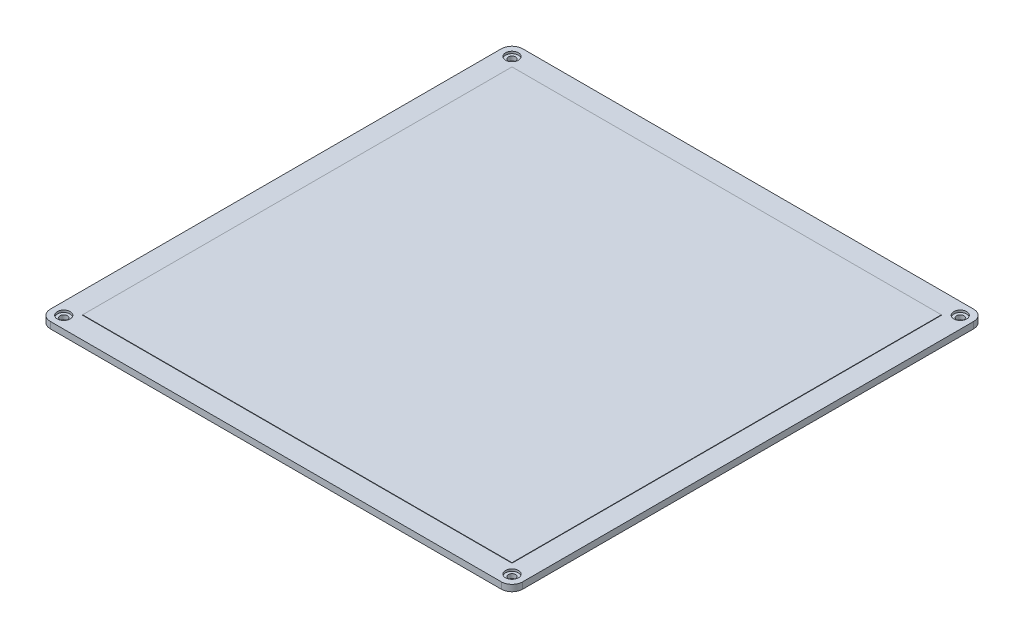
ISO-10303-21;
HEADER;
FILE_DESCRIPTION(('STEP AP214'),'2;1');
FILE_NAME('part.step','',(''),(''),'','','');
FILE_SCHEMA(('AUTOMOTIVE_DESIGN { 1 0 10303 214 1 1 1 1 }'));
ENDSEC;
DATA;
#1=APPLICATION_CONTEXT('core data for automotive mechanical design processes');
#2=APPLICATION_PROTOCOL_DEFINITION('international standard','automotive_design',2000,#1);
#3=PRODUCT_CONTEXT('',#1,'mechanical');
#4=PRODUCT('Part','Part','',(#3));
#5=PRODUCT_RELATED_PRODUCT_CATEGORY('part','',(#4));
#6=PRODUCT_DEFINITION_FORMATION('','',#4);
#7=PRODUCT_DEFINITION_CONTEXT('part definition',#1,'design');
#8=PRODUCT_DEFINITION('design','',#6,#7);
#9=PRODUCT_DEFINITION_SHAPE('','',#8);
#10=(LENGTH_UNIT() NAMED_UNIT(*) SI_UNIT(.MILLI.,.METRE.));
#11=(NAMED_UNIT(*) PLANE_ANGLE_UNIT() SI_UNIT($,.RADIAN.));
#12=(NAMED_UNIT(*) SI_UNIT($,.STERADIAN.) SOLID_ANGLE_UNIT());
#13=UNCERTAINTY_MEASURE_WITH_UNIT(LENGTH_MEASURE(1.E-05),#10,'distance_accuracy_value','');
#14=(GEOMETRIC_REPRESENTATION_CONTEXT(3) GLOBAL_UNCERTAINTY_ASSIGNED_CONTEXT((#13)) GLOBAL_UNIT_ASSIGNED_CONTEXT((#10,
#11,#12)) REPRESENTATION_CONTEXT('',''));
#15=CARTESIAN_POINT('',(0.,0.,0.));
#16=DIRECTION('',(0.,0.,1.));
#17=DIRECTION('',(1.,0.,0.));
#18=AXIS2_PLACEMENT_3D('',#15,#16,#17);
#19=CARTESIAN_POINT('',(-104.4,3.,-104.4));
#20=DIRECTION('',(0.,-1.,0.));
#21=DIRECTION('',(0.,0.,-1.));
#22=AXIS2_PLACEMENT_3D('',#19,#20,#21);
#23=CYLINDRICAL_SURFACE('',#22,1.7);
#24=CARTESIAN_POINT('',(-104.4,0.,-104.4));
#25=DIRECTION('',(0.,1.,0.));
#26=DIRECTION('',(0.,0.,1.));
#27=AXIS2_PLACEMENT_3D('',#24,#25,#26);
#28=CIRCLE('',#27,1.7);
#29=CARTESIAN_POINT('',(-104.4,0.,-102.7));
#30=VERTEX_POINT('',#29);
#31=EDGE_CURVE('E144',#30,#30,#28,.T.);
#32=ORIENTED_EDGE('',*,*,#31,.F.);
#33=EDGE_LOOP('',(#32));
#34=FACE_BOUND('',#33,.T.);
#35=CARTESIAN_POINT('',(-104.4,2.,-104.4));
#36=DIRECTION('',(0.,1.,0.));
#37=DIRECTION('',(0.,0.,1.));
#38=AXIS2_PLACEMENT_3D('',#35,#36,#37);
#39=CIRCLE('',#38,1.7);
#40=CARTESIAN_POINT('',(-104.4,2.,-102.7));
#41=VERTEX_POINT('',#40);
#42=EDGE_CURVE('E524',#41,#41,#39,.T.);
#43=ORIENTED_EDGE('',*,*,#42,.T.);
#44=EDGE_LOOP('',(#43));
#45=FACE_BOUND('',#44,.T.);
#46=ADVANCED_FACE('F17',(#34,#45),#23,.F.);
#47=CARTESIAN_POINT('',(-104.4,3.,104.4));
#48=DIRECTION('',(0.,-1.,0.));
#49=DIRECTION('',(0.,0.,-1.));
#50=AXIS2_PLACEMENT_3D('',#47,#48,#49);
#51=CYLINDRICAL_SURFACE('',#50,1.7);
#52=CARTESIAN_POINT('',(-104.4,0.,104.4));
#53=DIRECTION('',(0.,1.,0.));
#54=DIRECTION('',(0.,0.,1.));
#55=AXIS2_PLACEMENT_3D('',#52,#53,#54);
#56=CIRCLE('',#55,1.7);
#57=CARTESIAN_POINT('',(-104.4,0.,106.1));
#58=VERTEX_POINT('',#57);
#59=EDGE_CURVE('E132',#58,#58,#56,.T.);
#60=ORIENTED_EDGE('',*,*,#59,.F.);
#61=EDGE_LOOP('',(#60));
#62=FACE_BOUND('',#61,.T.);
#63=CARTESIAN_POINT('',(-104.4,2.,104.4));
#64=DIRECTION('',(0.,1.,0.));
#65=DIRECTION('',(0.,0.,1.));
#66=AXIS2_PLACEMENT_3D('',#63,#64,#65);
#67=CIRCLE('',#66,1.7);
#68=CARTESIAN_POINT('',(-104.4,2.,106.1));
#69=VERTEX_POINT('',#68);
#70=EDGE_CURVE('E506',#69,#69,#67,.T.);
#71=ORIENTED_EDGE('',*,*,#70,.T.);
#72=EDGE_LOOP('',(#71));
#73=FACE_BOUND('',#72,.T.);
#74=ADVANCED_FACE('F246',(#62,#73),#51,.F.);
#75=CARTESIAN_POINT('',(104.4,3.,104.4));
#76=DIRECTION('',(0.,-1.,0.));
#77=DIRECTION('',(0.,0.,-1.));
#78=AXIS2_PLACEMENT_3D('',#75,#76,#77);
#79=CYLINDRICAL_SURFACE('',#78,1.7);
#80=CARTESIAN_POINT('',(104.4,0.,104.4));
#81=DIRECTION('',(0.,1.,0.));
#82=DIRECTION('',(0.,0.,1.));
#83=AXIS2_PLACEMENT_3D('',#80,#81,#82);
#84=CIRCLE('',#83,1.7);
#85=CARTESIAN_POINT('',(104.4,0.,106.1));
#86=VERTEX_POINT('',#85);
#87=EDGE_CURVE('E135',#86,#86,#84,.T.);
#88=ORIENTED_EDGE('',*,*,#87,.F.);
#89=EDGE_LOOP('',(#88));
#90=FACE_BOUND('',#89,.T.);
#91=CARTESIAN_POINT('',(104.4,2.,104.4));
#92=DIRECTION('',(0.,1.,0.));
#93=DIRECTION('',(0.,0.,1.));
#94=AXIS2_PLACEMENT_3D('',#91,#92,#93);
#95=CIRCLE('',#94,1.7);
#96=CARTESIAN_POINT('',(104.4,2.,106.1));
#97=VERTEX_POINT('',#96);
#98=EDGE_CURVE('E483',#97,#97,#95,.T.);
#99=ORIENTED_EDGE('',*,*,#98,.T.);
#100=EDGE_LOOP('',(#99));
#101=FACE_BOUND('',#100,.T.);
#102=ADVANCED_FACE('F253',(#90,#101),#79,.F.);
#103=CARTESIAN_POINT('',(0.,3.,0.));
#104=DIRECTION('',(0.,1.,0.));
#105=DIRECTION('',(0.,0.,1.));
#106=AXIS2_PLACEMENT_3D('',#103,#104,#105);
#107=PLANE('',#106);
#108=CARTESIAN_POINT('',(-104.4,3.,-104.4));
#109=DIRECTION('',(0.,1.,0.));
#110=DIRECTION('',(0.,0.,1.));
#111=AXIS2_PLACEMENT_3D('',#108,#109,#110);
#112=CIRCLE('',#111,3.);
#113=CARTESIAN_POINT('',(-104.4,3.,-101.4));
#114=VERTEX_POINT('',#113);
#115=EDGE_CURVE('E530',#114,#114,#112,.T.);
#116=ORIENTED_EDGE('',*,*,#115,.F.);
#117=EDGE_LOOP('',(#116));
#118=FACE_BOUND('',#117,.T.);
#119=CARTESIAN_POINT('',(104.4,3.,-104.4));
#120=DIRECTION('',(0.,1.,0.));
#121=DIRECTION('',(0.,0.,1.));
#122=AXIS2_PLACEMENT_3D('',#119,#120,#121);
#123=CIRCLE('',#122,3.);
#124=CARTESIAN_POINT('',(104.4,3.,-101.4));
#125=VERTEX_POINT('',#124);
#126=EDGE_CURVE('E521',#125,#125,#123,.T.);
#127=ORIENTED_EDGE('',*,*,#126,.F.);
#128=EDGE_LOOP('',(#127));
#129=FACE_BOUND('',#128,.T.);
#130=CARTESIAN_POINT('',(-104.4,3.,104.4));
#131=DIRECTION('',(0.,1.,0.));
#132=DIRECTION('',(0.,0.,1.));
#133=AXIS2_PLACEMENT_3D('',#130,#131,#132);
#134=CIRCLE('',#133,3.);
#135=CARTESIAN_POINT('',(-104.4,3.,107.4));
#136=VERTEX_POINT('',#135);
#137=EDGE_CURVE('E512',#136,#136,#134,.T.);
#138=ORIENTED_EDGE('',*,*,#137,.F.);
#139=EDGE_LOOP('',(#138));
#140=FACE_BOUND('',#139,.T.);
#141=CARTESIAN_POINT('',(104.4,3.,104.4));
#142=DIRECTION('',(0.,1.,0.));
#143=DIRECTION('',(0.,0.,1.));
#144=AXIS2_PLACEMENT_3D('',#141,#142,#143);
#145=CIRCLE('',#144,3.);
#146=CARTESIAN_POINT('',(104.4,3.,107.4));
#147=VERTEX_POINT('',#146);
#148=EDGE_CURVE('E489',#147,#147,#145,.T.);
#149=ORIENTED_EDGE('',*,*,#148,.F.);
#150=EDGE_LOOP('',(#149));
#151=FACE_BOUND('',#150,.T.);
#152=DIRECTION('',(-1.,0.,0.));
#153=VECTOR('',#152,1.);
#154=CARTESIAN_POINT('',(110.,3.,-110.));
#155=LINE('',#154,#153);
#156=CARTESIAN_POINT('',(105.,3.,-110.));
#157=VERTEX_POINT('',#156);
#158=CARTESIAN_POINT('',(-105.,3.,-110.));
#159=VERTEX_POINT('',#158);
#160=EDGE_CURVE('E158',#157,#159,#155,.T.);
#161=ORIENTED_EDGE('',*,*,#160,.T.);
#162=CARTESIAN_POINT('',(-105.,3.,-105.));
#163=DIRECTION('',(0.,1.,0.));
#164=DIRECTION('',(0.,0.,1.));
#165=AXIS2_PLACEMENT_3D('',#162,#163,#164);
#166=CIRCLE('',#165,5.);
#167=CARTESIAN_POINT('',(-110.,3.,-105.));
#168=VERTEX_POINT('',#167);
#169=EDGE_CURVE('E193',#159,#168,#166,.T.);
#170=ORIENTED_EDGE('',*,*,#169,.T.);
#171=DIRECTION('',(0.,0.,1.));
#172=VECTOR('',#171,1.);
#173=CARTESIAN_POINT('',(-110.,3.,110.));
#174=LINE('',#173,#172);
#175=CARTESIAN_POINT('',(-110.,3.,105.));
#176=VERTEX_POINT('',#175);
#177=EDGE_CURVE('E150',#168,#176,#174,.T.);
#178=ORIENTED_EDGE('',*,*,#177,.T.);
#179=CARTESIAN_POINT('',(-105.,3.,105.));
#180=DIRECTION('',(0.,1.,0.));
#181=DIRECTION('',(0.,0.,1.));
#182=AXIS2_PLACEMENT_3D('',#179,#180,#181);
#183=CIRCLE('',#182,5.);
#184=CARTESIAN_POINT('',(-105.,3.,110.));
#185=VERTEX_POINT('',#184);
#186=EDGE_CURVE('E188',#176,#185,#183,.T.);
#187=ORIENTED_EDGE('',*,*,#186,.T.);
#188=DIRECTION('',(1.,0.,0.));
#189=VECTOR('',#188,1.);
#190=CARTESIAN_POINT('',(110.,3.,110.));
#191=LINE('',#190,#189);
#192=CARTESIAN_POINT('',(105.,3.,110.));
#193=VERTEX_POINT('',#192);
#194=EDGE_CURVE('E153',#185,#193,#191,.T.);
#195=ORIENTED_EDGE('',*,*,#194,.T.);
#196=CARTESIAN_POINT('',(105.,3.,105.));
#197=DIRECTION('',(0.,1.,0.));
#198=DIRECTION('',(0.,0.,1.));
#199=AXIS2_PLACEMENT_3D('',#196,#197,#198);
#200=CIRCLE('',#199,5.);
#201=CARTESIAN_POINT('',(110.,3.,105.));
#202=VERTEX_POINT('',#201);
#203=EDGE_CURVE('E39',#193,#202,#200,.T.);
#204=ORIENTED_EDGE('',*,*,#203,.T.);
#205=DIRECTION('',(0.,0.,-1.));
#206=VECTOR('',#205,1.);
#207=CARTESIAN_POINT('',(110.,3.,110.));
#208=LINE('',#207,#206);
#209=CARTESIAN_POINT('',(110.,3.,-105.));
#210=VERTEX_POINT('',#209);
#211=EDGE_CURVE('E156',#202,#210,#208,.T.);
#212=ORIENTED_EDGE('',*,*,#211,.T.);
#213=CARTESIAN_POINT('',(105.,3.,-105.));
#214=DIRECTION('',(0.,1.,0.));
#215=DIRECTION('',(0.,0.,1.));
#216=AXIS2_PLACEMENT_3D('',#213,#214,#215);
#217=CIRCLE('',#216,5.);
#218=EDGE_CURVE('E191',#210,#157,#217,.T.);
#219=ORIENTED_EDGE('',*,*,#218,.T.);
#220=EDGE_LOOP('',(#161,#170,#178,#187,#195,#204,#212,#219));
#221=FACE_BOUND('',#220,.T.);
#222=DIRECTION('',(1.,0.,0.));
#223=VECTOR('',#222,1.);
#224=CARTESIAN_POINT('',(100.,3.,100.));
#225=LINE('',#224,#223);
#226=CARTESIAN_POINT('',(-100.,3.,100.));
#227=VERTEX_POINT('',#226);
#228=CARTESIAN_POINT('',(100.,3.,100.));
#229=VERTEX_POINT('',#228);
#230=EDGE_CURVE('E486',#227,#229,#225,.T.);
#231=ORIENTED_EDGE('',*,*,#230,.F.);
#232=DIRECTION('',(0.,0.,1.));
#233=VECTOR('',#232,1.);
#234=CARTESIAN_POINT('',(-100.,3.,100.));
#235=LINE('',#234,#233);
#236=CARTESIAN_POINT('',(-100.,3.,-100.));
#237=VERTEX_POINT('',#236);
#238=EDGE_CURVE('E130',#237,#227,#235,.T.);
#239=ORIENTED_EDGE('',*,*,#238,.F.);
#240=DIRECTION('',(-1.,0.,0.));
#241=VECTOR('',#240,1.);
#242=CARTESIAN_POINT('',(100.,3.,-100.));
#243=LINE('',#242,#241);
#244=CARTESIAN_POINT('',(100.,3.,-100.));
#245=VERTEX_POINT('',#244);
#246=EDGE_CURVE('E126',#245,#237,#243,.T.);
#247=ORIENTED_EDGE('',*,*,#246,.F.);
#248=DIRECTION('',(0.,0.,-1.));
#249=VECTOR('',#248,1.);
#250=CARTESIAN_POINT('',(100.,3.,100.));
#251=LINE('',#250,#249);
#252=EDGE_CURVE('E497',#229,#245,#251,.T.);
#253=ORIENTED_EDGE('',*,*,#252,.F.);
#254=EDGE_LOOP('',(#231,#239,#247,#253));
#255=FACE_BOUND('',#254,.T.);
#256=ADVANCED_FACE('F216',(#118,#129,#140,#151,#221,#255),#107,.T.);
#257=CARTESIAN_POINT('',(-110.,3.,110.));
#258=DIRECTION('',(1.,0.,0.));
#259=DIRECTION('',(0.,0.,-1.));
#260=AXIS2_PLACEMENT_3D('',#257,#258,#259);
#261=PLANE('',#260);
#262=ORIENTED_EDGE('',*,*,#177,.F.);
#263=DIRECTION('',(0.,-1.,0.));
#264=VECTOR('',#263,1.);
#265=CARTESIAN_POINT('',(-110.,3.,-105.));
#266=LINE('',#265,#264);
#267=CARTESIAN_POINT('',(-110.,0.,-105.));
#268=VERTEX_POINT('',#267);
#269=EDGE_CURVE('E172',#168,#268,#266,.T.);
#270=ORIENTED_EDGE('',*,*,#269,.T.);
#271=DIRECTION('',(0.,0.,1.));
#272=VECTOR('',#271,1.);
#273=CARTESIAN_POINT('',(-110.,0.,110.));
#274=LINE('',#273,#272);
#275=CARTESIAN_POINT('',(-110.,0.,105.));
#276=VERTEX_POINT('',#275);
#277=EDGE_CURVE('E149',#268,#276,#274,.T.);
#278=ORIENTED_EDGE('',*,*,#277,.T.);
#279=DIRECTION('',(0.,-1.,0.));
#280=VECTOR('',#279,1.);
#281=CARTESIAN_POINT('',(-110.,3.,105.));
#282=LINE('',#281,#280);
#283=EDGE_CURVE('E161',#276,#176,#282,.F.);
#284=ORIENTED_EDGE('',*,*,#283,.T.);
#285=EDGE_LOOP('',(#262,#270,#278,#284));
#286=FACE_BOUND('',#285,.T.);
#287=ADVANCED_FACE('F232',(#286),#261,.F.);
#288=CARTESIAN_POINT('',(110.,3.,110.));
#289=DIRECTION('',(0.,0.,-1.));
#290=DIRECTION('',(-1.,0.,0.));
#291=AXIS2_PLACEMENT_3D('',#288,#289,#290);
#292=PLANE('',#291);
#293=DIRECTION('',(1.,0.,0.));
#294=VECTOR('',#293,1.);
#295=CARTESIAN_POINT('',(110.,0.,110.));
#296=LINE('',#295,#294);
#297=CARTESIAN_POINT('',(-105.,0.,110.));
#298=VERTEX_POINT('',#297);
#299=CARTESIAN_POINT('',(105.,0.,110.));
#300=VERTEX_POINT('',#299);
#301=EDGE_CURVE('E164',#298,#300,#296,.T.);
#302=ORIENTED_EDGE('',*,*,#301,.T.);
#303=DIRECTION('',(0.,-1.,0.));
#304=VECTOR('',#303,1.);
#305=CARTESIAN_POINT('',(105.,3.,110.));
#306=LINE('',#305,#304);
#307=EDGE_CURVE('E11',#300,#193,#306,.F.);
#308=ORIENTED_EDGE('',*,*,#307,.T.);
#309=ORIENTED_EDGE('',*,*,#194,.F.);
#310=DIRECTION('',(0.,-1.,0.));
#311=VECTOR('',#310,1.);
#312=CARTESIAN_POINT('',(-105.,3.,110.));
#313=LINE('',#312,#311);
#314=EDGE_CURVE('E25',#185,#298,#313,.T.);
#315=ORIENTED_EDGE('',*,*,#314,.T.);
#316=EDGE_LOOP('',(#302,#308,#309,#315));
#317=FACE_BOUND('',#316,.T.);
#318=ADVANCED_FACE('F203',(#317),#292,.F.);
#319=CARTESIAN_POINT('',(110.,3.,110.));
#320=DIRECTION('',(-1.,0.,0.));
#321=DIRECTION('',(0.,0.,1.));
#322=AXIS2_PLACEMENT_3D('',#319,#320,#321);
#323=PLANE('',#322);
#324=DIRECTION('',(0.,0.,-1.));
#325=VECTOR('',#324,1.);
#326=CARTESIAN_POINT('',(110.,0.,110.));
#327=LINE('',#326,#325);
#328=CARTESIAN_POINT('',(110.,0.,105.));
#329=VERTEX_POINT('',#328);
#330=CARTESIAN_POINT('',(110.,0.,-105.));
#331=VERTEX_POINT('',#330);
#332=EDGE_CURVE('E167',#329,#331,#327,.T.);
#333=ORIENTED_EDGE('',*,*,#332,.T.);
#334=DIRECTION('',(0.,-1.,0.));
#335=VECTOR('',#334,1.);
#336=CARTESIAN_POINT('',(110.,3.,-105.));
#337=LINE('',#336,#335);
#338=EDGE_CURVE('E32',#331,#210,#337,.F.);
#339=ORIENTED_EDGE('',*,*,#338,.T.);
#340=ORIENTED_EDGE('',*,*,#211,.F.);
#341=DIRECTION('',(0.,-1.,0.));
#342=VECTOR('',#341,1.);
#343=CARTESIAN_POINT('',(110.,3.,105.));
#344=LINE('',#343,#342);
#345=EDGE_CURVE('E195',#202,#329,#344,.T.);
#346=ORIENTED_EDGE('',*,*,#345,.T.);
#347=EDGE_LOOP('',(#333,#339,#340,#346));
#348=FACE_BOUND('',#347,.T.);
#349=ADVANCED_FACE('F214',(#348),#323,.F.);
#350=CARTESIAN_POINT('',(110.,3.,-110.));
#351=DIRECTION('',(0.,0.,1.));
#352=DIRECTION('',(1.,0.,0.));
#353=AXIS2_PLACEMENT_3D('',#350,#351,#352);
#354=PLANE('',#353);
#355=DIRECTION('',(-1.,0.,0.));
#356=VECTOR('',#355,1.);
#357=CARTESIAN_POINT('',(110.,0.,-110.));
#358=LINE('',#357,#356);
#359=CARTESIAN_POINT('',(105.,0.,-110.));
#360=VERTEX_POINT('',#359);
#361=CARTESIAN_POINT('',(-105.,0.,-110.));
#362=VERTEX_POINT('',#361);
#363=EDGE_CURVE('E154',#360,#362,#358,.T.);
#364=ORIENTED_EDGE('',*,*,#363,.T.);
#365=DIRECTION('',(0.,-1.,0.));
#366=VECTOR('',#365,1.);
#367=CARTESIAN_POINT('',(-105.,3.,-110.));
#368=LINE('',#367,#366);
#369=EDGE_CURVE('E186',#362,#159,#368,.F.);
#370=ORIENTED_EDGE('',*,*,#369,.T.);
#371=ORIENTED_EDGE('',*,*,#160,.F.);
#372=DIRECTION('',(0.,-1.,0.));
#373=VECTOR('',#372,1.);
#374=CARTESIAN_POINT('',(105.,3.,-110.));
#375=LINE('',#374,#373);
#376=EDGE_CURVE('E183',#157,#360,#375,.T.);
#377=ORIENTED_EDGE('',*,*,#376,.T.);
#378=EDGE_LOOP('',(#364,#370,#371,#377));
#379=FACE_BOUND('',#378,.T.);
#380=ADVANCED_FACE('F224',(#379),#354,.F.);
#381=CARTESIAN_POINT('',(0.,0.,0.));
#382=DIRECTION('',(0.,1.,0.));
#383=DIRECTION('',(0.,0.,1.));
#384=AXIS2_PLACEMENT_3D('',#381,#382,#383);
#385=PLANE('',#384);
#386=CARTESIAN_POINT('',(104.4,0.,-104.4));
#387=DIRECTION('',(0.,1.,0.));
#388=DIRECTION('',(0.,0.,1.));
#389=AXIS2_PLACEMENT_3D('',#386,#387,#388);
#390=CIRCLE('',#389,1.7);
#391=CARTESIAN_POINT('',(104.4,0.,-102.7));
#392=VERTEX_POINT('',#391);
#393=EDGE_CURVE('E141',#392,#392,#390,.T.);
#394=ORIENTED_EDGE('',*,*,#393,.T.);
#395=EDGE_LOOP('',(#394));
#396=FACE_BOUND('',#395,.T.);
#397=ORIENTED_EDGE('',*,*,#87,.T.);
#398=EDGE_LOOP('',(#397));
#399=FACE_BOUND('',#398,.T.);
#400=ORIENTED_EDGE('',*,*,#59,.T.);
#401=EDGE_LOOP('',(#400));
#402=FACE_BOUND('',#401,.T.);
#403=ORIENTED_EDGE('',*,*,#31,.T.);
#404=EDGE_LOOP('',(#403));
#405=FACE_BOUND('',#404,.T.);
#406=ORIENTED_EDGE('',*,*,#277,.F.);
#407=CARTESIAN_POINT('',(-105.,0.,-105.));
#408=DIRECTION('',(0.,1.,0.));
#409=DIRECTION('',(0.,0.,1.));
#410=AXIS2_PLACEMENT_3D('',#407,#408,#409);
#411=CIRCLE('',#410,5.);
#412=EDGE_CURVE('E181',#268,#362,#411,.F.);
#413=ORIENTED_EDGE('',*,*,#412,.T.);
#414=ORIENTED_EDGE('',*,*,#363,.F.);
#415=CARTESIAN_POINT('',(105.,0.,-105.));
#416=DIRECTION('',(0.,1.,0.));
#417=DIRECTION('',(0.,0.,1.));
#418=AXIS2_PLACEMENT_3D('',#415,#416,#417);
#419=CIRCLE('',#418,5.);
#420=EDGE_CURVE('E179',#360,#331,#419,.F.);
#421=ORIENTED_EDGE('',*,*,#420,.T.);
#422=ORIENTED_EDGE('',*,*,#332,.F.);
#423=CARTESIAN_POINT('',(105.,0.,105.));
#424=DIRECTION('',(0.,1.,0.));
#425=DIRECTION('',(0.,0.,1.));
#426=AXIS2_PLACEMENT_3D('',#423,#424,#425);
#427=CIRCLE('',#426,5.);
#428=EDGE_CURVE('E177',#329,#300,#427,.F.);
#429=ORIENTED_EDGE('',*,*,#428,.T.);
#430=ORIENTED_EDGE('',*,*,#301,.F.);
#431=CARTESIAN_POINT('',(-105.,0.,105.));
#432=DIRECTION('',(0.,1.,0.));
#433=DIRECTION('',(0.,0.,1.));
#434=AXIS2_PLACEMENT_3D('',#431,#432,#433);
#435=CIRCLE('',#434,5.);
#436=EDGE_CURVE('E175',#298,#276,#435,.F.);
#437=ORIENTED_EDGE('',*,*,#436,.T.);
#438=EDGE_LOOP('',(#406,#413,#414,#421,#422,#429,#430,#437));
#439=FACE_BOUND('',#438,.T.);
#440=ADVANCED_FACE('F209',(#396,#399,#402,#405,#439),#385,.F.);
#441=CARTESIAN_POINT('',(104.4,3.,-104.4));
#442=DIRECTION('',(0.,-1.,0.));
#443=DIRECTION('',(0.,0.,-1.));
#444=AXIS2_PLACEMENT_3D('',#441,#442,#443);
#445=CYLINDRICAL_SURFACE('',#444,1.7);
#446=CARTESIAN_POINT('',(104.4,2.,-104.4));
#447=DIRECTION('',(0.,1.,0.));
#448=DIRECTION('',(0.,0.,1.));
#449=AXIS2_PLACEMENT_3D('',#446,#447,#448);
#450=CIRCLE('',#449,1.7);
#451=CARTESIAN_POINT('',(104.4,2.,-102.7));
#452=VERTEX_POINT('',#451);
#453=EDGE_CURVE('E515',#452,#452,#450,.T.);
#454=ORIENTED_EDGE('',*,*,#453,.T.);
#455=EDGE_LOOP('',(#454));
#456=FACE_BOUND('',#455,.T.);
#457=ORIENTED_EDGE('',*,*,#393,.F.);
#458=EDGE_LOOP('',(#457));
#459=FACE_BOUND('',#458,.T.);
#460=ADVANCED_FACE('F265',(#456,#459),#445,.F.);
#461=CARTESIAN_POINT('',(-100.,3.2,100.));
#462=DIRECTION('',(1.,0.,0.));
#463=DIRECTION('',(0.,0.,-1.));
#464=AXIS2_PLACEMENT_3D('',#461,#462,#463);
#465=PLANE('',#464);
#466=ORIENTED_EDGE('',*,*,#238,.T.);
#467=DIRECTION('',(0.,-1.,0.));
#468=VECTOR('',#467,1.);
#469=CARTESIAN_POINT('',(-100.,3.2,100.));
#470=LINE('',#469,#468);
#471=CARTESIAN_POINT('',(-100.,3.2,100.));
#472=VERTEX_POINT('',#471);
#473=EDGE_CURVE('E110',#472,#227,#470,.T.);
#474=ORIENTED_EDGE('',*,*,#473,.F.);
#475=DIRECTION('',(0.,0.,1.));
#476=VECTOR('',#475,1.);
#477=CARTESIAN_POINT('',(-100.,3.2,100.));
#478=LINE('',#477,#476);
#479=CARTESIAN_POINT('',(-100.,3.2,-100.));
#480=VERTEX_POINT('',#479);
#481=EDGE_CURVE('E117',#480,#472,#478,.T.);
#482=ORIENTED_EDGE('',*,*,#481,.F.);
#483=DIRECTION('',(0.,-1.,0.));
#484=VECTOR('',#483,1.);
#485=CARTESIAN_POINT('',(-100.,3.2,-100.));
#486=LINE('',#485,#484);
#487=EDGE_CURVE('E494',#480,#237,#486,.T.);
#488=ORIENTED_EDGE('',*,*,#487,.T.);
#489=EDGE_LOOP('',(#466,#474,#482,#488));
#490=FACE_BOUND('',#489,.T.);
#491=ADVANCED_FACE('F128',(#490),#465,.F.);
#492=CARTESIAN_POINT('',(100.,3.2,100.));
#493=DIRECTION('',(0.,0.,-1.));
#494=DIRECTION('',(-1.,0.,0.));
#495=AXIS2_PLACEMENT_3D('',#492,#493,#494);
#496=PLANE('',#495);
#497=ORIENTED_EDGE('',*,*,#230,.T.);
#498=DIRECTION('',(0.,-1.,0.));
#499=VECTOR('',#498,1.);
#500=CARTESIAN_POINT('',(100.,3.2,100.));
#501=LINE('',#500,#499);
#502=CARTESIAN_POINT('',(100.,3.2,100.));
#503=VERTEX_POINT('',#502);
#504=EDGE_CURVE('E113',#503,#229,#501,.T.);
#505=ORIENTED_EDGE('',*,*,#504,.F.);
#506=DIRECTION('',(1.,0.,0.));
#507=VECTOR('',#506,1.);
#508=CARTESIAN_POINT('',(100.,3.2,100.));
#509=LINE('',#508,#507);
#510=EDGE_CURVE('E106',#472,#503,#509,.T.);
#511=ORIENTED_EDGE('',*,*,#510,.F.);
#512=ORIENTED_EDGE('',*,*,#473,.T.);
#513=EDGE_LOOP('',(#497,#505,#511,#512));
#514=FACE_BOUND('',#513,.T.);
#515=ADVANCED_FACE('F108',(#514),#496,.F.);
#516=CARTESIAN_POINT('',(100.,3.2,100.));
#517=DIRECTION('',(-1.,0.,0.));
#518=DIRECTION('',(0.,0.,1.));
#519=AXIS2_PLACEMENT_3D('',#516,#517,#518);
#520=PLANE('',#519);
#521=ORIENTED_EDGE('',*,*,#252,.T.);
#522=DIRECTION('',(0.,-1.,0.));
#523=VECTOR('',#522,1.);
#524=CARTESIAN_POINT('',(100.,3.2,-100.));
#525=LINE('',#524,#523);
#526=CARTESIAN_POINT('',(100.,3.2,-100.));
#527=VERTEX_POINT('',#526);
#528=EDGE_CURVE('E137',#527,#245,#525,.T.);
#529=ORIENTED_EDGE('',*,*,#528,.F.);
#530=DIRECTION('',(0.,0.,-1.));
#531=VECTOR('',#530,1.);
#532=CARTESIAN_POINT('',(100.,3.2,100.));
#533=LINE('',#532,#531);
#534=EDGE_CURVE('E116',#503,#527,#533,.T.);
#535=ORIENTED_EDGE('',*,*,#534,.F.);
#536=ORIENTED_EDGE('',*,*,#504,.T.);
#537=EDGE_LOOP('',(#521,#529,#535,#536));
#538=FACE_BOUND('',#537,.T.);
#539=ADVANCED_FACE('F391',(#538),#520,.F.);
#540=CARTESIAN_POINT('',(100.,3.2,-100.));
#541=DIRECTION('',(0.,0.,1.));
#542=DIRECTION('',(1.,0.,0.));
#543=AXIS2_PLACEMENT_3D('',#540,#541,#542);
#544=PLANE('',#543);
#545=ORIENTED_EDGE('',*,*,#246,.T.);
#546=ORIENTED_EDGE('',*,*,#487,.F.);
#547=DIRECTION('',(-1.,0.,0.));
#548=VECTOR('',#547,1.);
#549=CARTESIAN_POINT('',(100.,3.2,-100.));
#550=LINE('',#549,#548);
#551=EDGE_CURVE('E122',#527,#480,#550,.T.);
#552=ORIENTED_EDGE('',*,*,#551,.F.);
#553=ORIENTED_EDGE('',*,*,#528,.T.);
#554=EDGE_LOOP('',(#545,#546,#552,#553));
#555=FACE_BOUND('',#554,.T.);
#556=ADVANCED_FACE('F384',(#555),#544,.F.);
#557=CARTESIAN_POINT('',(0.,3.2,0.));
#558=DIRECTION('',(0.,1.,0.));
#559=DIRECTION('',(0.,0.,1.));
#560=AXIS2_PLACEMENT_3D('',#557,#558,#559);
#561=PLANE('',#560);
#562=ORIENTED_EDGE('',*,*,#481,.T.);
#563=ORIENTED_EDGE('',*,*,#510,.T.);
#564=ORIENTED_EDGE('',*,*,#534,.T.);
#565=ORIENTED_EDGE('',*,*,#551,.T.);
#566=EDGE_LOOP('',(#562,#563,#564,#565));
#567=FACE_BOUND('',#566,.T.);
#568=ADVANCED_FACE('F120',(#567),#561,.T.);
#569=CARTESIAN_POINT('',(-105.,3.,-105.));
#570=DIRECTION('',(0.,-1.,0.));
#571=DIRECTION('',(0.,0.,-1.));
#572=AXIS2_PLACEMENT_3D('',#569,#570,#571);
#573=CYLINDRICAL_SURFACE('',#572,5.);
#574=ORIENTED_EDGE('',*,*,#169,.F.);
#575=ORIENTED_EDGE('',*,*,#369,.F.);
#576=ORIENTED_EDGE('',*,*,#412,.F.);
#577=ORIENTED_EDGE('',*,*,#269,.F.);
#578=EDGE_LOOP('',(#574,#575,#576,#577));
#579=FACE_BOUND('',#578,.T.);
#580=ADVANCED_FACE('F229',(#579),#573,.T.);
#581=CARTESIAN_POINT('',(105.,3.,-105.));
#582=DIRECTION('',(0.,-1.,0.));
#583=DIRECTION('',(0.,0.,-1.));
#584=AXIS2_PLACEMENT_3D('',#581,#582,#583);
#585=CYLINDRICAL_SURFACE('',#584,5.);
#586=ORIENTED_EDGE('',*,*,#218,.F.);
#587=ORIENTED_EDGE('',*,*,#338,.F.);
#588=ORIENTED_EDGE('',*,*,#420,.F.);
#589=ORIENTED_EDGE('',*,*,#376,.F.);
#590=EDGE_LOOP('',(#586,#587,#588,#589));
#591=FACE_BOUND('',#590,.T.);
#592=ADVANCED_FACE('F221',(#591),#585,.T.);
#593=CARTESIAN_POINT('',(105.,3.,105.));
#594=DIRECTION('',(0.,-1.,0.));
#595=DIRECTION('',(0.,0.,-1.));
#596=AXIS2_PLACEMENT_3D('',#593,#594,#595);
#597=CYLINDRICAL_SURFACE('',#596,5.);
#598=ORIENTED_EDGE('',*,*,#203,.F.);
#599=ORIENTED_EDGE('',*,*,#307,.F.);
#600=ORIENTED_EDGE('',*,*,#428,.F.);
#601=ORIENTED_EDGE('',*,*,#345,.F.);
#602=EDGE_LOOP('',(#598,#599,#600,#601));
#603=FACE_BOUND('',#602,.T.);
#604=ADVANCED_FACE('F213',(#603),#597,.T.);
#605=CARTESIAN_POINT('',(-105.,3.,105.));
#606=DIRECTION('',(0.,-1.,0.));
#607=DIRECTION('',(0.,0.,-1.));
#608=AXIS2_PLACEMENT_3D('',#605,#606,#607);
#609=CYLINDRICAL_SURFACE('',#608,5.);
#610=ORIENTED_EDGE('',*,*,#186,.F.);
#611=ORIENTED_EDGE('',*,*,#283,.F.);
#612=ORIENTED_EDGE('',*,*,#436,.F.);
#613=ORIENTED_EDGE('',*,*,#314,.F.);
#614=EDGE_LOOP('',(#610,#611,#612,#613));
#615=FACE_BOUND('',#614,.T.);
#616=ADVANCED_FACE('F19',(#615),#609,.T.);
#617=CARTESIAN_POINT('',(106.1,2.,104.4));
#618=DIRECTION('',(0.,-1.,0.));
#619=DIRECTION('',(0.,0.,-1.));
#620=AXIS2_PLACEMENT_3D('',#617,#618,#619);
#621=PLANE('',#620);
#622=ORIENTED_EDGE('',*,*,#98,.F.);
#623=EDGE_LOOP('',(#622));
#624=FACE_BOUND('',#623,.T.);
#625=CARTESIAN_POINT('',(104.4,2.,104.4));
#626=DIRECTION('',(0.,1.,0.));
#627=DIRECTION('',(0.,0.,1.));
#628=AXIS2_PLACEMENT_3D('',#625,#626,#627);
#629=CIRCLE('',#628,3.);
#630=CARTESIAN_POINT('',(104.4,2.,107.4));
#631=VERTEX_POINT('',#630);
#632=EDGE_CURVE('E484',#631,#631,#629,.T.);
#633=ORIENTED_EDGE('',*,*,#632,.T.);
#634=EDGE_LOOP('',(#633));
#635=FACE_BOUND('',#634,.T.);
#636=ADVANCED_FACE('F235',(#624,#635),#621,.F.);
#637=CARTESIAN_POINT('',(104.4,3.,104.4));
#638=DIRECTION('',(0.,1.,0.));
#639=DIRECTION('',(0.,0.,1.));
#640=AXIS2_PLACEMENT_3D('',#637,#638,#639);
#641=CYLINDRICAL_SURFACE('',#640,3.);
#642=ORIENTED_EDGE('',*,*,#632,.F.);
#643=EDGE_LOOP('',(#642));
#644=FACE_BOUND('',#643,.T.);
#645=ORIENTED_EDGE('',*,*,#148,.T.);
#646=EDGE_LOOP('',(#645));
#647=FACE_BOUND('',#646,.T.);
#648=ADVANCED_FACE('F242',(#644,#647),#641,.F.);
#649=CARTESIAN_POINT('',(-102.7,2.,104.4));
#650=DIRECTION('',(0.,-1.,0.));
#651=DIRECTION('',(0.,0.,-1.));
#652=AXIS2_PLACEMENT_3D('',#649,#650,#651);
#653=PLANE('',#652);
#654=ORIENTED_EDGE('',*,*,#70,.F.);
#655=EDGE_LOOP('',(#654));
#656=FACE_BOUND('',#655,.T.);
#657=CARTESIAN_POINT('',(-104.4,2.,104.4));
#658=DIRECTION('',(0.,1.,0.));
#659=DIRECTION('',(0.,0.,1.));
#660=AXIS2_PLACEMENT_3D('',#657,#658,#659);
#661=CIRCLE('',#660,3.);
#662=CARTESIAN_POINT('',(-104.4,2.,107.4));
#663=VERTEX_POINT('',#662);
#664=EDGE_CURVE('E509',#663,#663,#661,.T.);
#665=ORIENTED_EDGE('',*,*,#664,.T.);
#666=EDGE_LOOP('',(#665));
#667=FACE_BOUND('',#666,.T.);
#668=ADVANCED_FACE('F313',(#656,#667),#653,.F.);
#669=CARTESIAN_POINT('',(-104.4,3.,104.4));
#670=DIRECTION('',(0.,1.,0.));
#671=DIRECTION('',(0.,0.,1.));
#672=AXIS2_PLACEMENT_3D('',#669,#670,#671);
#673=CYLINDRICAL_SURFACE('',#672,3.);
#674=ORIENTED_EDGE('',*,*,#664,.F.);
#675=EDGE_LOOP('',(#674));
#676=FACE_BOUND('',#675,.T.);
#677=ORIENTED_EDGE('',*,*,#137,.T.);
#678=EDGE_LOOP('',(#677));
#679=FACE_BOUND('',#678,.T.);
#680=ADVANCED_FACE('F324',(#676,#679),#673,.F.);
#681=CARTESIAN_POINT('',(106.1,2.,-104.4));
#682=DIRECTION('',(0.,-1.,0.));
#683=DIRECTION('',(0.,0.,-1.));
#684=AXIS2_PLACEMENT_3D('',#681,#682,#683);
#685=PLANE('',#684);
#686=ORIENTED_EDGE('',*,*,#453,.F.);
#687=EDGE_LOOP('',(#686));
#688=FACE_BOUND('',#687,.T.);
#689=CARTESIAN_POINT('',(104.4,2.,-104.4));
#690=DIRECTION('',(0.,1.,0.));
#691=DIRECTION('',(0.,0.,1.));
#692=AXIS2_PLACEMENT_3D('',#689,#690,#691);
#693=CIRCLE('',#692,3.);
#694=CARTESIAN_POINT('',(104.4,2.,-101.4));
#695=VERTEX_POINT('',#694);
#696=EDGE_CURVE('E518',#695,#695,#693,.T.);
#697=ORIENTED_EDGE('',*,*,#696,.T.);
#698=EDGE_LOOP('',(#697));
#699=FACE_BOUND('',#698,.T.);
#700=ADVANCED_FACE('F334',(#688,#699),#685,.F.);
#701=CARTESIAN_POINT('',(104.4,3.,-104.4));
#702=DIRECTION('',(0.,1.,0.));
#703=DIRECTION('',(0.,0.,1.));
#704=AXIS2_PLACEMENT_3D('',#701,#702,#703);
#705=CYLINDRICAL_SURFACE('',#704,3.);
#706=ORIENTED_EDGE('',*,*,#696,.F.);
#707=EDGE_LOOP('',(#706));
#708=FACE_BOUND('',#707,.T.);
#709=ORIENTED_EDGE('',*,*,#126,.T.);
#710=EDGE_LOOP('',(#709));
#711=FACE_BOUND('',#710,.T.);
#712=ADVANCED_FACE('F344',(#708,#711),#705,.F.);
#713=CARTESIAN_POINT('',(-102.7,2.,-104.4));
#714=DIRECTION('',(0.,-1.,0.));
#715=DIRECTION('',(0.,0.,-1.));
#716=AXIS2_PLACEMENT_3D('',#713,#714,#715);
#717=PLANE('',#716);
#718=ORIENTED_EDGE('',*,*,#42,.F.);
#719=EDGE_LOOP('',(#718));
#720=FACE_BOUND('',#719,.T.);
#721=CARTESIAN_POINT('',(-104.4,2.,-104.4));
#722=DIRECTION('',(0.,1.,0.));
#723=DIRECTION('',(0.,0.,1.));
#724=AXIS2_PLACEMENT_3D('',#721,#722,#723);
#725=CIRCLE('',#724,3.);
#726=CARTESIAN_POINT('',(-104.4,2.,-101.4));
#727=VERTEX_POINT('',#726);
#728=EDGE_CURVE('E527',#727,#727,#725,.T.);
#729=ORIENTED_EDGE('',*,*,#728,.T.);
#730=EDGE_LOOP('',(#729));
#731=FACE_BOUND('',#730,.T.);
#732=ADVANCED_FACE('F354',(#720,#731),#717,.F.);
#733=CARTESIAN_POINT('',(-104.4,3.,-104.4));
#734=DIRECTION('',(0.,1.,0.));
#735=DIRECTION('',(0.,0.,1.));
#736=AXIS2_PLACEMENT_3D('',#733,#734,#735);
#737=CYLINDRICAL_SURFACE('',#736,3.);
#738=ORIENTED_EDGE('',*,*,#728,.F.);
#739=EDGE_LOOP('',(#738));
#740=FACE_BOUND('',#739,.T.);
#741=ORIENTED_EDGE('',*,*,#115,.T.);
#742=EDGE_LOOP('',(#741));
#743=FACE_BOUND('',#742,.T.);
#744=ADVANCED_FACE('F364',(#740,#743),#737,.F.);
#745=CLOSED_SHELL('',(#46,#74,#102,#256,#287,#318,#349,#380,#440,#460,#491,#515,#539,#556,#568,
#580,#592,#604,#616,#636,#648,#668,#680,#700,#712,#732,#744));
#746=MANIFOLD_SOLID_BREP('B1',#745);
#747=ADVANCED_BREP_SHAPE_REPRESENTATION('',(#18,#746),#14);
#748=SHAPE_DEFINITION_REPRESENTATION(#9,#747);
ENDSEC;
END-ISO-10303-21;
